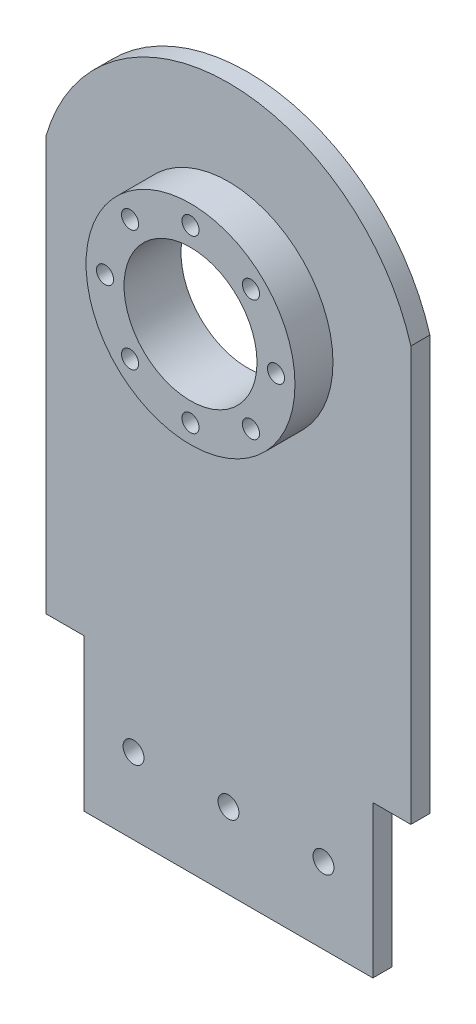
ISO-10303-21;
HEADER;
FILE_DESCRIPTION(('STEP AP214'),'2;1');
FILE_NAME('part.step','',(''),(''),'','','');
FILE_SCHEMA(('AUTOMOTIVE_DESIGN { 1 0 10303 214 1 1 1 1 }'));
ENDSEC;
DATA;
#1=APPLICATION_CONTEXT('core data for automotive mechanical design processes');
#2=APPLICATION_PROTOCOL_DEFINITION('international standard','automotive_design',2000,#1);
#3=PRODUCT_CONTEXT('',#1,'mechanical');
#4=PRODUCT('Part','Part','',(#3));
#5=PRODUCT_RELATED_PRODUCT_CATEGORY('part','',(#4));
#6=PRODUCT_DEFINITION_FORMATION('','',#4);
#7=PRODUCT_DEFINITION_CONTEXT('part definition',#1,'design');
#8=PRODUCT_DEFINITION('design','',#6,#7);
#9=PRODUCT_DEFINITION_SHAPE('','',#8);
#10=(LENGTH_UNIT() NAMED_UNIT(*) SI_UNIT(.MILLI.,.METRE.));
#11=(NAMED_UNIT(*) PLANE_ANGLE_UNIT() SI_UNIT($,.RADIAN.));
#12=(NAMED_UNIT(*) SI_UNIT($,.STERADIAN.) SOLID_ANGLE_UNIT());
#13=UNCERTAINTY_MEASURE_WITH_UNIT(LENGTH_MEASURE(1.E-05),#10,'distance_accuracy_value','');
#14=(GEOMETRIC_REPRESENTATION_CONTEXT(3) GLOBAL_UNCERTAINTY_ASSIGNED_CONTEXT((#13)) GLOBAL_UNIT_ASSIGNED_CONTEXT((#10,
#11,#12)) REPRESENTATION_CONTEXT('',''));
#15=CARTESIAN_POINT('',(0.,0.,0.));
#16=DIRECTION('',(0.,0.,1.));
#17=DIRECTION('',(1.,0.,0.));
#18=AXIS2_PLACEMENT_3D('',#15,#16,#17);
#19=CARTESIAN_POINT('',(0.,95.07,5.));
#20=DIRECTION('',(0.,0.,1.));
#21=DIRECTION('',(1.,0.,0.));
#22=AXIS2_PLACEMENT_3D('',#19,#20,#21);
#23=PLANE('',#22);
#24=CARTESIAN_POINT('',(25.,-20.,5.));
#25=DIRECTION('',(0.,0.,1.));
#26=DIRECTION('',(1.,0.,0.));
#27=AXIS2_PLACEMENT_3D('',#24,#25,#26);
#28=CIRCLE('',#27,2.75);
#29=CARTESIAN_POINT('',(27.75,-20.,4.99999999999999));
#30=VERTEX_POINT('',#29);
#31=EDGE_CURVE('E125',#30,#30,#28,.T.);
#32=ORIENTED_EDGE('',*,*,#31,.F.);
#33=EDGE_LOOP('',(#32));
#34=FACE_BOUND('',#33,.T.);
#35=CARTESIAN_POINT('',(-25.,-20.,5.));
#36=DIRECTION('',(0.,0.,1.));
#37=DIRECTION('',(-1.,0.,0.));
#38=AXIS2_PLACEMENT_3D('',#35,#36,#37);
#39=CIRCLE('',#38,2.75);
#40=CARTESIAN_POINT('',(-22.25,-20.,4.99999999999999));
#41=VERTEX_POINT('',#40);
#42=EDGE_CURVE('E128',#41,#41,#39,.T.);
#43=ORIENTED_EDGE('',*,*,#42,.F.);
#44=EDGE_LOOP('',(#43));
#45=FACE_BOUND('',#44,.T.);
#46=CARTESIAN_POINT('',(0.,-20.,5.));
#47=DIRECTION('',(0.,0.,1.));
#48=DIRECTION('',(1.,0.,0.));
#49=AXIS2_PLACEMENT_3D('',#46,#47,#48);
#50=CIRCLE('',#49,2.75);
#51=CARTESIAN_POINT('',(2.75,-20.,4.99999999999999));
#52=VERTEX_POINT('',#51);
#53=EDGE_CURVE('E267',#52,#52,#50,.T.);
#54=ORIENTED_EDGE('',*,*,#53,.F.);
#55=EDGE_LOOP('',(#54));
#56=FACE_BOUND('',#55,.T.);
#57=DIRECTION('',(0.,1.,0.));
#58=VECTOR('',#57,1.);
#59=CARTESIAN_POINT('',(48.,109.07,5.));
#60=LINE('',#59,#58);
#61=CARTESIAN_POINT('',(48.,0.,5.));
#62=VERTEX_POINT('',#61);
#63=CARTESIAN_POINT('',(48.,109.07,5.));
#64=VERTEX_POINT('',#63);
#65=EDGE_CURVE('E146',#62,#64,#60,.T.);
#66=ORIENTED_EDGE('',*,*,#65,.T.);
#67=CARTESIAN_POINT('',(0.,95.07,5.));
#68=DIRECTION('',(0.,0.,1.));
#69=DIRECTION('',(1.,0.,0.));
#70=AXIS2_PLACEMENT_3D('',#67,#68,#69);
#71=CIRCLE('',#70,50.);
#72=CARTESIAN_POINT('',(-48.,109.07,5.));
#73=VERTEX_POINT('',#72);
#74=EDGE_CURVE('E148',#64,#73,#71,.T.);
#75=ORIENTED_EDGE('',*,*,#74,.T.);
#76=DIRECTION('',(0.,-1.,0.));
#77=VECTOR('',#76,1.);
#78=CARTESIAN_POINT('',(-48.,109.07,5.));
#79=LINE('',#78,#77);
#80=CARTESIAN_POINT('',(-48.,0.,5.));
#81=VERTEX_POINT('',#80);
#82=EDGE_CURVE('E151',#73,#81,#79,.T.);
#83=ORIENTED_EDGE('',*,*,#82,.T.);
#84=DIRECTION('',(1.,0.,0.));
#85=VECTOR('',#84,1.);
#86=CARTESIAN_POINT('',(-48.,0.,5.));
#87=LINE('',#86,#85);
#88=CARTESIAN_POINT('',(-38.,0.,5.));
#89=VERTEX_POINT('',#88);
#90=EDGE_CURVE('E124',#81,#89,#87,.T.);
#91=ORIENTED_EDGE('',*,*,#90,.T.);
#92=DIRECTION('',(0.,-1.,0.));
#93=VECTOR('',#92,1.);
#94=CARTESIAN_POINT('',(-38.,0.,5.));
#95=LINE('',#94,#93);
#96=CARTESIAN_POINT('',(-38.,-40.,5.));
#97=VERTEX_POINT('',#96);
#98=EDGE_CURVE('E106',#89,#97,#95,.T.);
#99=ORIENTED_EDGE('',*,*,#98,.T.);
#100=DIRECTION('',(1.,0.,0.));
#101=VECTOR('',#100,1.);
#102=CARTESIAN_POINT('',(-38.,-40.,5.));
#103=LINE('',#102,#101);
#104=CARTESIAN_POINT('',(38.,-40.,5.));
#105=VERTEX_POINT('',#104);
#106=EDGE_CURVE('E115',#97,#105,#103,.T.);
#107=ORIENTED_EDGE('',*,*,#106,.T.);
#108=DIRECTION('',(0.,1.,0.));
#109=VECTOR('',#108,1.);
#110=CARTESIAN_POINT('',(38.,0.,5.));
#111=LINE('',#110,#109);
#112=CARTESIAN_POINT('',(38.,0.,5.));
#113=VERTEX_POINT('',#112);
#114=EDGE_CURVE('E112',#105,#113,#111,.T.);
#115=ORIENTED_EDGE('',*,*,#114,.T.);
#116=EDGE_CURVE('E153',#113,#62,#87,.T.);
#117=ORIENTED_EDGE('',*,*,#116,.T.);
#118=EDGE_LOOP('',(#66,#75,#83,#91,#99,#107,#115,#117));
#119=FACE_BOUND('',#118,.T.);
#120=CARTESIAN_POINT('',(0.,95.07,5.));
#121=DIRECTION('',(0.,0.,1.));
#122=DIRECTION('',(1.,0.,0.));
#123=AXIS2_PLACEMENT_3D('',#120,#121,#122);
#124=CIRCLE('',#123,27.5);
#125=CARTESIAN_POINT('',(27.5,95.07,5.));
#126=VERTEX_POINT('',#125);
#127=EDGE_CURVE('E263',#126,#126,#124,.T.);
#128=ORIENTED_EDGE('',*,*,#127,.F.);
#129=EDGE_LOOP('',(#128));
#130=FACE_BOUND('',#129,.T.);
#131=ADVANCED_FACE('F35',(#34,#45,#56,#119,#130),#23,.T.);
#132=CARTESIAN_POINT('',(-48.,0.,5.));
#133=DIRECTION('',(0.,1.,0.));
#134=DIRECTION('',(0.,0.,1.));
#135=AXIS2_PLACEMENT_3D('',#132,#133,#134);
#136=PLANE('',#135);
#137=DIRECTION('',(0.,0.,1.));
#138=VECTOR('',#137,1.);
#139=CARTESIAN_POINT('',(38.,0.,-85.8836422143356));
#140=LINE('',#139,#138);
#141=CARTESIAN_POINT('',(38.,0.,0.));
#142=VERTEX_POINT('',#141);
#143=EDGE_CURVE('E58',#142,#113,#140,.T.);
#144=ORIENTED_EDGE('',*,*,#143,.F.);
#145=DIRECTION('',(1.,0.,0.));
#146=VECTOR('',#145,1.);
#147=CARTESIAN_POINT('',(-48.,0.,0.));
#148=LINE('',#147,#146);
#149=CARTESIAN_POINT('',(48.,0.,0.));
#150=VERTEX_POINT('',#149);
#151=EDGE_CURVE('E162',#142,#150,#148,.T.);
#152=ORIENTED_EDGE('',*,*,#151,.T.);
#153=DIRECTION('',(0.,0.,-1.));
#154=VECTOR('',#153,1.);
#155=CARTESIAN_POINT('',(48.,0.,5.));
#156=LINE('',#155,#154);
#157=EDGE_CURVE('E155',#62,#150,#156,.T.);
#158=ORIENTED_EDGE('',*,*,#157,.F.);
#159=ORIENTED_EDGE('',*,*,#116,.F.);
#160=EDGE_LOOP('',(#144,#152,#158,#159));
#161=FACE_BOUND('',#160,.T.);
#162=ADVANCED_FACE('F185',(#161),#136,.F.);
#163=CARTESIAN_POINT('',(0.,95.07,0.));
#164=DIRECTION('',(0.,0.,1.));
#165=DIRECTION('',(1.,0.,0.));
#166=AXIS2_PLACEMENT_3D('',#163,#164,#165);
#167=PLANE('',#166);
#168=CARTESIAN_POINT('',(0.,117.57,0.));
#169=DIRECTION('',(0.,0.,1.));
#170=DIRECTION('',(1.,0.,0.));
#171=AXIS2_PLACEMENT_3D('',#168,#169,#170);
#172=CIRCLE('',#171,2.25);
#173=CARTESIAN_POINT('',(2.25,117.57,0.));
#174=VERTEX_POINT('',#173);
#175=EDGE_CURVE('E215',#174,#174,#172,.T.);
#176=ORIENTED_EDGE('',*,*,#175,.T.);
#177=EDGE_LOOP('',(#176));
#178=FACE_BOUND('',#177,.T.);
#179=CARTESIAN_POINT('',(15.9099025766977,110.979902576698,0.));
#180=DIRECTION('',(0.,0.,1.));
#181=DIRECTION('',(1.,0.,0.));
#182=AXIS2_PLACEMENT_3D('',#179,#180,#181);
#183=CIRCLE('',#182,2.24999999999999);
#184=CARTESIAN_POINT('',(18.1599025766976,110.979902576698,0.));
#185=VERTEX_POINT('',#184);
#186=EDGE_CURVE('E219',#185,#185,#183,.T.);
#187=ORIENTED_EDGE('',*,*,#186,.T.);
#188=EDGE_LOOP('',(#187));
#189=FACE_BOUND('',#188,.T.);
#190=CARTESIAN_POINT('',(22.500000000001,95.0700000000009,0.));
#191=DIRECTION('',(0.,0.,1.));
#192=DIRECTION('',(1.,0.,0.));
#193=AXIS2_PLACEMENT_3D('',#190,#191,#192);
#194=CIRCLE('',#193,2.24999999999999);
#195=CARTESIAN_POINT('',(24.750000000001,95.0700000000009,0.));
#196=VERTEX_POINT('',#195);
#197=EDGE_CURVE('E223',#196,#196,#194,.T.);
#198=ORIENTED_EDGE('',*,*,#197,.T.);
#199=EDGE_LOOP('',(#198));
#200=FACE_BOUND('',#199,.T.);
#201=CARTESIAN_POINT('',(15.9099025766973,79.1600974233027,0.));
#202=DIRECTION('',(0.,0.,1.));
#203=DIRECTION('',(1.,0.,0.));
#204=AXIS2_PLACEMENT_3D('',#201,#202,#203);
#205=CIRCLE('',#204,2.24999999999875);
#206=CARTESIAN_POINT('',(18.1599025766961,79.1600974233027,0.));
#207=VERTEX_POINT('',#206);
#208=EDGE_CURVE('E227',#207,#207,#205,.T.);
#209=ORIENTED_EDGE('',*,*,#208,.T.);
#210=EDGE_LOOP('',(#209));
#211=FACE_BOUND('',#210,.T.);
#212=CARTESIAN_POINT('',(0.,72.57,0.));
#213=DIRECTION('',(0.,0.,1.));
#214=DIRECTION('',(1.,0.,0.));
#215=AXIS2_PLACEMENT_3D('',#212,#213,#214);
#216=CIRCLE('',#215,2.24999999999833);
#217=CARTESIAN_POINT('',(2.24999999999833,72.57,0.));
#218=VERTEX_POINT('',#217);
#219=EDGE_CURVE('E231',#218,#218,#216,.T.);
#220=ORIENTED_EDGE('',*,*,#219,.T.);
#221=EDGE_LOOP('',(#220));
#222=FACE_BOUND('',#221,.T.);
#223=CARTESIAN_POINT('',(-15.9099025766973,79.1600974233027,0.));
#224=DIRECTION('',(0.,0.,1.));
#225=DIRECTION('',(1.,0.,0.));
#226=AXIS2_PLACEMENT_3D('',#223,#224,#225);
#227=CIRCLE('',#226,2.24999999999842);
#228=CARTESIAN_POINT('',(-13.6599025766989,79.1600974233027,0.));
#229=VERTEX_POINT('',#228);
#230=EDGE_CURVE('E235',#229,#229,#227,.T.);
#231=ORIENTED_EDGE('',*,*,#230,.T.);
#232=EDGE_LOOP('',(#231));
#233=FACE_BOUND('',#232,.T.);
#234=CARTESIAN_POINT('',(-22.499999999999,95.0699999999993,0.));
#235=DIRECTION('',(0.,0.,1.));
#236=DIRECTION('',(1.,0.,0.));
#237=AXIS2_PLACEMENT_3D('',#234,#235,#236);
#238=CIRCLE('',#237,2.25);
#239=CARTESIAN_POINT('',(-20.249999999999,95.0699999999993,0.));
#240=VERTEX_POINT('',#239);
#241=EDGE_CURVE('E239',#240,#240,#238,.T.);
#242=ORIENTED_EDGE('',*,*,#241,.T.);
#243=EDGE_LOOP('',(#242));
#244=FACE_BOUND('',#243,.T.);
#245=CARTESIAN_POINT('',(-15.9099025766968,110.979902576697,0.));
#246=DIRECTION('',(0.,0.,1.));
#247=DIRECTION('',(1.,0.,0.));
#248=AXIS2_PLACEMENT_3D('',#245,#246,#247);
#249=CIRCLE('',#248,2.24999999999999);
#250=CARTESIAN_POINT('',(-13.6599025766969,110.979902576697,0.));
#251=VERTEX_POINT('',#250);
#252=EDGE_CURVE('E242',#251,#251,#249,.T.);
#253=ORIENTED_EDGE('',*,*,#252,.T.);
#254=EDGE_LOOP('',(#253));
#255=FACE_BOUND('',#254,.T.);
#256=DIRECTION('',(0.,1.,0.));
#257=VECTOR('',#256,1.);
#258=CARTESIAN_POINT('',(48.,109.07,0.));
#259=LINE('',#258,#257);
#260=CARTESIAN_POINT('',(48.,109.07,0.));
#261=VERTEX_POINT('',#260);
#262=EDGE_CURVE('E145',#150,#261,#259,.T.);
#263=ORIENTED_EDGE('',*,*,#262,.F.);
#264=ORIENTED_EDGE('',*,*,#151,.F.);
#265=DIRECTION('',(0.,-1.,0.));
#266=VECTOR('',#265,1.);
#267=CARTESIAN_POINT('',(38.,0.,0.));
#268=LINE('',#267,#266);
#269=CARTESIAN_POINT('',(38.,-40.,0.));
#270=VERTEX_POINT('',#269);
#271=EDGE_CURVE('E134',#142,#270,#268,.T.);
#272=ORIENTED_EDGE('',*,*,#271,.T.);
#273=DIRECTION('',(-1.,0.,0.));
#274=VECTOR('',#273,1.);
#275=CARTESIAN_POINT('',(-38.,-40.,0.));
#276=LINE('',#275,#274);
#277=CARTESIAN_POINT('',(-38.,-40.,0.));
#278=VERTEX_POINT('',#277);
#279=EDGE_CURVE('E272',#270,#278,#276,.T.);
#280=ORIENTED_EDGE('',*,*,#279,.T.);
#281=DIRECTION('',(0.,1.,0.));
#282=VECTOR('',#281,1.);
#283=CARTESIAN_POINT('',(-38.,0.,0.));
#284=LINE('',#283,#282);
#285=CARTESIAN_POINT('',(-38.,0.,0.));
#286=VERTEX_POINT('',#285);
#287=EDGE_CURVE('E108',#278,#286,#284,.T.);
#288=ORIENTED_EDGE('',*,*,#287,.T.);
#289=CARTESIAN_POINT('',(-48.,0.,0.));
#290=VERTEX_POINT('',#289);
#291=EDGE_CURVE('E149',#290,#286,#148,.T.);
#292=ORIENTED_EDGE('',*,*,#291,.F.);
#293=DIRECTION('',(0.,-1.,0.));
#294=VECTOR('',#293,1.);
#295=CARTESIAN_POINT('',(-48.,109.07,0.));
#296=LINE('',#295,#294);
#297=CARTESIAN_POINT('',(-48.,109.07,0.));
#298=VERTEX_POINT('',#297);
#299=EDGE_CURVE('E160',#298,#290,#296,.T.);
#300=ORIENTED_EDGE('',*,*,#299,.F.);
#301=CARTESIAN_POINT('',(0.,95.07,0.));
#302=DIRECTION('',(0.,0.,1.));
#303=DIRECTION('',(1.,0.,0.));
#304=AXIS2_PLACEMENT_3D('',#301,#302,#303);
#305=CIRCLE('',#304,50.);
#306=EDGE_CURVE('E158',#261,#298,#305,.T.);
#307=ORIENTED_EDGE('',*,*,#306,.F.);
#308=EDGE_LOOP('',(#263,#264,#272,#280,#288,#292,#300,#307));
#309=FACE_BOUND('',#308,.T.);
#310=CARTESIAN_POINT('',(0.,95.07,0.));
#311=DIRECTION('',(0.,0.,1.));
#312=DIRECTION('',(1.,0.,0.));
#313=AXIS2_PLACEMENT_3D('',#310,#311,#312);
#314=CIRCLE('',#313,17.5);
#315=CARTESIAN_POINT('',(17.5,95.07,0.));
#316=VERTEX_POINT('',#315);
#317=EDGE_CURVE('E142',#316,#316,#314,.T.);
#318=ORIENTED_EDGE('',*,*,#317,.T.);
#319=EDGE_LOOP('',(#318));
#320=FACE_BOUND('',#319,.T.);
#321=CARTESIAN_POINT('',(-25.,-20.,0.));
#322=DIRECTION('',(0.,0.,1.));
#323=DIRECTION('',(1.,0.,0.));
#324=AXIS2_PLACEMENT_3D('',#321,#322,#323);
#325=CIRCLE('',#324,2.75);
#326=CARTESIAN_POINT('',(-22.25,-20.,0.));
#327=VERTEX_POINT('',#326);
#328=EDGE_CURVE('E141',#327,#327,#325,.F.);
#329=ORIENTED_EDGE('',*,*,#328,.F.);
#330=EDGE_LOOP('',(#329));
#331=FACE_BOUND('',#330,.T.);
#332=CARTESIAN_POINT('',(0.,-20.,0.));
#333=DIRECTION('',(0.,0.,1.));
#334=DIRECTION('',(1.,0.,0.));
#335=AXIS2_PLACEMENT_3D('',#332,#333,#334);
#336=CIRCLE('',#335,2.75);
#337=CARTESIAN_POINT('',(2.75,-20.,0.));
#338=VERTEX_POINT('',#337);
#339=EDGE_CURVE('E137',#338,#338,#336,.F.);
#340=ORIENTED_EDGE('',*,*,#339,.F.);
#341=EDGE_LOOP('',(#340));
#342=FACE_BOUND('',#341,.T.);
#343=CARTESIAN_POINT('',(25.,-20.,0.));
#344=DIRECTION('',(0.,0.,1.));
#345=DIRECTION('',(1.,0.,0.));
#346=AXIS2_PLACEMENT_3D('',#343,#344,#345);
#347=CIRCLE('',#346,2.75);
#348=CARTESIAN_POINT('',(27.75,-20.,0.));
#349=VERTEX_POINT('',#348);
#350=EDGE_CURVE('E140',#349,#349,#347,.F.);
#351=ORIENTED_EDGE('',*,*,#350,.F.);
#352=EDGE_LOOP('',(#351));
#353=FACE_BOUND('',#352,.T.);
#354=ADVANCED_FACE('F179',(#178,#189,#200,#211,#222,#233,#244,#255,#309,#320,#331,#342,#353),
#167,.F.);
#355=CARTESIAN_POINT('',(48.,109.07,5.));
#356=DIRECTION('',(-1.,0.,0.));
#357=DIRECTION('',(0.,-1.,0.));
#358=AXIS2_PLACEMENT_3D('',#355,#356,#357);
#359=PLANE('',#358);
#360=ORIENTED_EDGE('',*,*,#262,.T.);
#361=DIRECTION('',(0.,0.,-1.));
#362=VECTOR('',#361,1.);
#363=CARTESIAN_POINT('',(48.,109.07,5.));
#364=LINE('',#363,#362);
#365=EDGE_CURVE('E11',#64,#261,#364,.T.);
#366=ORIENTED_EDGE('',*,*,#365,.F.);
#367=ORIENTED_EDGE('',*,*,#65,.F.);
#368=ORIENTED_EDGE('',*,*,#157,.T.);
#369=EDGE_LOOP('',(#360,#366,#367,#368));
#370=FACE_BOUND('',#369,.T.);
#371=ADVANCED_FACE('F37',(#370),#359,.F.);
#372=CARTESIAN_POINT('',(0.,95.07,5.));
#373=DIRECTION('',(0.,0.,-1.));
#374=DIRECTION('',(-1.,0.,0.));
#375=AXIS2_PLACEMENT_3D('',#372,#373,#374);
#376=CYLINDRICAL_SURFACE('',#375,50.);
#377=ORIENTED_EDGE('',*,*,#306,.T.);
#378=DIRECTION('',(0.,0.,-1.));
#379=VECTOR('',#378,1.);
#380=CARTESIAN_POINT('',(-48.,109.07,5.));
#381=LINE('',#380,#379);
#382=EDGE_CURVE('E43',#73,#298,#381,.T.);
#383=ORIENTED_EDGE('',*,*,#382,.F.);
#384=ORIENTED_EDGE('',*,*,#74,.F.);
#385=ORIENTED_EDGE('',*,*,#365,.T.);
#386=EDGE_LOOP('',(#377,#383,#384,#385));
#387=FACE_BOUND('',#386,.T.);
#388=ADVANCED_FACE('F192',(#387),#376,.T.);
#389=CARTESIAN_POINT('',(-48.,109.07,5.));
#390=DIRECTION('',(1.,0.,0.));
#391=DIRECTION('',(0.,1.,0.));
#392=AXIS2_PLACEMENT_3D('',#389,#390,#391);
#393=PLANE('',#392);
#394=ORIENTED_EDGE('',*,*,#299,.T.);
#395=DIRECTION('',(0.,0.,-1.));
#396=VECTOR('',#395,1.);
#397=CARTESIAN_POINT('',(-48.,0.,5.));
#398=LINE('',#397,#396);
#399=EDGE_CURVE('E166',#81,#290,#398,.T.);
#400=ORIENTED_EDGE('',*,*,#399,.F.);
#401=ORIENTED_EDGE('',*,*,#82,.F.);
#402=ORIENTED_EDGE('',*,*,#382,.T.);
#403=EDGE_LOOP('',(#394,#400,#401,#402));
#404=FACE_BOUND('',#403,.T.);
#405=ADVANCED_FACE('F173',(#404),#393,.F.);
#406=ORIENTED_EDGE('',*,*,#291,.T.);
#407=DIRECTION('',(0.,0.,1.));
#408=VECTOR('',#407,1.);
#409=CARTESIAN_POINT('',(-38.,0.,-85.8836422143356));
#410=LINE('',#409,#408);
#411=EDGE_CURVE('E50',#286,#89,#410,.T.);
#412=ORIENTED_EDGE('',*,*,#411,.T.);
#413=ORIENTED_EDGE('',*,*,#90,.F.);
#414=ORIENTED_EDGE('',*,*,#399,.T.);
#415=EDGE_LOOP('',(#406,#412,#413,#414));
#416=FACE_BOUND('',#415,.T.);
#417=ADVANCED_FACE('F181',(#416),#136,.F.);
#418=CARTESIAN_POINT('',(0.,95.07,5.));
#419=DIRECTION('',(0.,0.,-1.));
#420=DIRECTION('',(-1.,0.,0.));
#421=AXIS2_PLACEMENT_3D('',#418,#419,#420);
#422=CYLINDRICAL_SURFACE('',#421,17.5);
#423=ORIENTED_EDGE('',*,*,#317,.F.);
#424=EDGE_LOOP('',(#423));
#425=FACE_BOUND('',#424,.T.);
#426=CARTESIAN_POINT('',(0.,95.07,15.));
#427=DIRECTION('',(0.,0.,1.));
#428=DIRECTION('',(1.,0.,0.));
#429=AXIS2_PLACEMENT_3D('',#426,#427,#428);
#430=CIRCLE('',#429,17.5);
#431=CARTESIAN_POINT('',(17.5,95.07,15.));
#432=VERTEX_POINT('',#431);
#433=EDGE_CURVE('E260',#432,#432,#430,.T.);
#434=ORIENTED_EDGE('',*,*,#433,.T.);
#435=EDGE_LOOP('',(#434));
#436=FACE_BOUND('',#435,.T.);
#437=ADVANCED_FACE('F183',(#425,#436),#422,.F.);
#438=CARTESIAN_POINT('',(-38.,-40.,-85.8836422143356));
#439=DIRECTION('',(0.,-1.,0.));
#440=DIRECTION('',(1.,0.,0.));
#441=AXIS2_PLACEMENT_3D('',#438,#439,#440);
#442=PLANE('',#441);
#443=ORIENTED_EDGE('',*,*,#279,.F.);
#444=DIRECTION('',(0.,0.,1.));
#445=VECTOR('',#444,1.);
#446=CARTESIAN_POINT('',(38.,-40.,-85.8836422143356));
#447=LINE('',#446,#445);
#448=EDGE_CURVE('E111',#270,#105,#447,.T.);
#449=ORIENTED_EDGE('',*,*,#448,.T.);
#450=ORIENTED_EDGE('',*,*,#106,.F.);
#451=DIRECTION('',(0.,0.,1.));
#452=VECTOR('',#451,1.);
#453=CARTESIAN_POINT('',(-38.,-40.,-85.8836422143356));
#454=LINE('',#453,#452);
#455=EDGE_CURVE('E102',#278,#97,#454,.T.);
#456=ORIENTED_EDGE('',*,*,#455,.F.);
#457=EDGE_LOOP('',(#443,#449,#450,#456));
#458=FACE_BOUND('',#457,.T.);
#459=ADVANCED_FACE('F116',(#458),#442,.T.);
#460=CARTESIAN_POINT('',(38.,0.,-85.8836422143356));
#461=DIRECTION('',(1.,0.,0.));
#462=DIRECTION('',(0.,1.,0.));
#463=AXIS2_PLACEMENT_3D('',#460,#461,#462);
#464=PLANE('',#463);
#465=ORIENTED_EDGE('',*,*,#271,.F.);
#466=ORIENTED_EDGE('',*,*,#143,.T.);
#467=ORIENTED_EDGE('',*,*,#114,.F.);
#468=ORIENTED_EDGE('',*,*,#448,.F.);
#469=EDGE_LOOP('',(#465,#466,#467,#468));
#470=FACE_BOUND('',#469,.T.);
#471=ADVANCED_FACE('F306',(#470),#464,.T.);
#472=CARTESIAN_POINT('',(-38.,0.,-85.8836422143356));
#473=DIRECTION('',(-1.,0.,0.));
#474=DIRECTION('',(0.,0.,1.));
#475=AXIS2_PLACEMENT_3D('',#472,#473,#474);
#476=PLANE('',#475);
#477=ORIENTED_EDGE('',*,*,#287,.F.);
#478=ORIENTED_EDGE('',*,*,#455,.T.);
#479=ORIENTED_EDGE('',*,*,#98,.F.);
#480=ORIENTED_EDGE('',*,*,#411,.F.);
#481=EDGE_LOOP('',(#477,#478,#479,#480));
#482=FACE_BOUND('',#481,.T.);
#483=ADVANCED_FACE('F104',(#482),#476,.T.);
#484=CARTESIAN_POINT('',(25.,-20.,-85.8836422143356));
#485=DIRECTION('',(0.,0.,1.));
#486=DIRECTION('',(1.,0.,0.));
#487=AXIS2_PLACEMENT_3D('',#484,#485,#486);
#488=CYLINDRICAL_SURFACE('',#487,2.75);
#489=CARTESIAN_POINT('',(27.75,-20.,0.));
#490=CARTESIAN_POINT('',(27.75,-20.,0.0520833333333183));
#491=CARTESIAN_POINT('',(27.75,-20.,0.104166666666651));
#492=CARTESIAN_POINT('',(27.75,-20.,0.208333333333315));
#493=CARTESIAN_POINT('',(27.75,-20.,0.260416666666647));
#494=CARTESIAN_POINT('',(27.75,-20.,0.364583333333316));
#495=CARTESIAN_POINT('',(27.75,-20.,0.416666666666653));
#496=CARTESIAN_POINT('',(27.75,-20.,0.520833333333322));
#497=CARTESIAN_POINT('',(27.75,-20.,0.572916666666654));
#498=CARTESIAN_POINT('',(27.75,-20.,0.677083333333319));
#499=CARTESIAN_POINT('',(27.75,-20.,0.729166666666651));
#500=CARTESIAN_POINT('',(27.75,-20.,0.83333333333332));
#501=CARTESIAN_POINT('',(27.75,-20.,0.885416666666657));
#502=CARTESIAN_POINT('',(27.75,-20.,0.989583333333326));
#503=CARTESIAN_POINT('',(27.75,-20.,1.04166666666666));
#504=CARTESIAN_POINT('',(27.75,-20.,1.14583333333332));
#505=CARTESIAN_POINT('',(27.75,-20.,1.19791666666665));
#506=CARTESIAN_POINT('',(27.75,-20.,1.30208333333332));
#507=CARTESIAN_POINT('',(27.75,-20.,1.35416666666665));
#508=CARTESIAN_POINT('',(27.75,-20.,1.45833333333332));
#509=CARTESIAN_POINT('',(27.75,-20.,1.51041666666665));
#510=CARTESIAN_POINT('',(27.75,-20.,1.61458333333332));
#511=CARTESIAN_POINT('',(27.75,-20.,1.66666666666665));
#512=CARTESIAN_POINT('',(27.75,-20.,1.77083333333332));
#513=CARTESIAN_POINT('',(27.75,-20.,1.82291666666666));
#514=CARTESIAN_POINT('',(27.75,-20.,1.92708333333332));
#515=CARTESIAN_POINT('',(27.75,-20.,1.97916666666665));
#516=CARTESIAN_POINT('',(27.75,-20.,2.08333333333332));
#517=CARTESIAN_POINT('',(27.75,-20.,2.13541666666666));
#518=CARTESIAN_POINT('',(27.75,-20.,2.23958333333333));
#519=CARTESIAN_POINT('',(27.75,-20.,2.29166666666666));
#520=CARTESIAN_POINT('',(27.75,-20.,2.39583333333332));
#521=CARTESIAN_POINT('',(27.75,-20.,2.44791666666666));
#522=CARTESIAN_POINT('',(27.75,-20.,2.55208333333332));
#523=CARTESIAN_POINT('',(27.75,-20.,2.60416666666665));
#524=CARTESIAN_POINT('',(27.75,-20.,2.70833333333332));
#525=CARTESIAN_POINT('',(27.75,-20.,2.76041666666665));
#526=CARTESIAN_POINT('',(27.75,-20.,2.86458333333332));
#527=CARTESIAN_POINT('',(27.75,-20.,2.91666666666666));
#528=CARTESIAN_POINT('',(27.75,-20.,3.02083333333332));
#529=CARTESIAN_POINT('',(27.75,-20.,3.07291666666666));
#530=CARTESIAN_POINT('',(27.75,-20.,3.17708333333332));
#531=CARTESIAN_POINT('',(27.75,-20.,3.22916666666665));
#532=CARTESIAN_POINT('',(27.75,-20.,3.33333333333332));
#533=CARTESIAN_POINT('',(27.75,-20.,3.38541666666666));
#534=CARTESIAN_POINT('',(27.75,-20.,3.48958333333333));
#535=CARTESIAN_POINT('',(27.75,-20.,3.54166666666666));
#536=CARTESIAN_POINT('',(27.75,-20.,3.64583333333333));
#537=CARTESIAN_POINT('',(27.75,-20.,3.69791666666666));
#538=CARTESIAN_POINT('',(27.75,-20.,3.80208333333332));
#539=CARTESIAN_POINT('',(27.75,-20.,3.85416666666665));
#540=CARTESIAN_POINT('',(27.75,-20.,3.95833333333332));
#541=CARTESIAN_POINT('',(27.75,-20.,4.01041666666665));
#542=CARTESIAN_POINT('',(27.75,-20.,4.11458333333332));
#543=CARTESIAN_POINT('',(27.75,-20.,4.16666666666666));
#544=CARTESIAN_POINT('',(27.75,-20.,4.27083333333333));
#545=CARTESIAN_POINT('',(27.75,-20.,4.32291666666666));
#546=CARTESIAN_POINT('',(27.75,-20.,4.42708333333332));
#547=CARTESIAN_POINT('',(27.75,-20.,4.47916666666665));
#548=CARTESIAN_POINT('',(27.75,-20.,4.58333333333332));
#549=CARTESIAN_POINT('',(27.75,-20.,4.63541666666666));
#550=CARTESIAN_POINT('',(27.75,-20.,4.73958333333333));
#551=CARTESIAN_POINT('',(27.75,-20.,4.79166666666666));
#552=CARTESIAN_POINT('',(27.75,-20.,4.89583333333333));
#553=CARTESIAN_POINT('',(27.75,-20.,4.94791666666666));
#554=CARTESIAN_POINT('',(27.75,-20.,4.99999999999999));
#555=B_SPLINE_CURVE_WITH_KNOTS('',3,(#489,#490,#491,#492,#493,#494,#495,#496,#497,#498,#499,
#500,#501,#502,#503,#504,#505,#506,#507,#508,#509,#510,#511,#512,#513,#514,#515,#516,#517,#518,
#519,#520,#521,#522,#523,#524,#525,#526,#527,#528,#529,#530,#531,#532,#533,#534,#535,#536,#537,
#538,#539,#540,#541,#542,#543,#544,#545,#546,#547,#548,#549,#550,#551,#552,#553,#554),
.UNSPECIFIED.,.F.,.F.,(4,2,2,2,2,2,2,2,2,2,2,2,2,2,2,2,2,2,2,2,2,2,2,2,2,2,2,2,2,2,2,2,4),(0.,
0.156249999999997,0.312499999999993,0.468750000000004,0.625000000000001,0.781249999999997,
0.937500000000008,1.09375,1.25,1.40625,1.56249999999999,1.71875,1.875,2.03125,2.18750000000001,
2.34375000000001,2.5,2.65625,2.8125,2.96875000000001,3.125,3.28125,3.43750000000001,
3.59375000000001,3.75,3.90625,4.0625,4.21875000000001,4.375,4.53125,4.68750000000001,
4.84375000000001,5.),.UNSPECIFIED.);
#556=EDGE_CURVE('BSEAM298',#349,#30,#555,.T.);
#557=ORIENTED_EDGE('',*,*,#350,.T.);
#558=ORIENTED_EDGE('',*,*,#31,.T.);
#559=ORIENTED_EDGE('',*,*,#556,.T.);
#560=ORIENTED_EDGE('',*,*,#556,.F.);
#561=EDGE_LOOP('',(#557,#559,#558,#560));
#562=FACE_BOUND('',#561,.T.);
#563=ADVANCED_FACE('F298',(#562),#488,.F.);
#564=CARTESIAN_POINT('',(-25.,-20.,-85.8836422143356));
#565=DIRECTION('',(0.,0.,1.));
#566=DIRECTION('',(1.,0.,0.));
#567=AXIS2_PLACEMENT_3D('',#564,#565,#566);
#568=CYLINDRICAL_SURFACE('',#567,2.75);
#569=CARTESIAN_POINT('',(-22.25,-20.,0.));
#570=CARTESIAN_POINT('',(-22.25,-20.,0.0520833333333183));
#571=CARTESIAN_POINT('',(-22.25,-20.,0.104166666666651));
#572=CARTESIAN_POINT('',(-22.25,-20.,0.208333333333315));
#573=CARTESIAN_POINT('',(-22.25,-20.,0.260416666666647));
#574=CARTESIAN_POINT('',(-22.25,-20.,0.364583333333316));
#575=CARTESIAN_POINT('',(-22.25,-20.,0.416666666666653));
#576=CARTESIAN_POINT('',(-22.25,-20.,0.520833333333322));
#577=CARTESIAN_POINT('',(-22.25,-20.,0.572916666666654));
#578=CARTESIAN_POINT('',(-22.25,-20.,0.677083333333319));
#579=CARTESIAN_POINT('',(-22.25,-20.,0.729166666666651));
#580=CARTESIAN_POINT('',(-22.25,-20.,0.83333333333332));
#581=CARTESIAN_POINT('',(-22.25,-20.,0.885416666666657));
#582=CARTESIAN_POINT('',(-22.25,-20.,0.989583333333326));
#583=CARTESIAN_POINT('',(-22.25,-20.,1.04166666666666));
#584=CARTESIAN_POINT('',(-22.25,-20.,1.14583333333332));
#585=CARTESIAN_POINT('',(-22.25,-20.,1.19791666666665));
#586=CARTESIAN_POINT('',(-22.25,-20.,1.30208333333332));
#587=CARTESIAN_POINT('',(-22.25,-20.,1.35416666666665));
#588=CARTESIAN_POINT('',(-22.25,-20.,1.45833333333332));
#589=CARTESIAN_POINT('',(-22.25,-20.,1.51041666666665));
#590=CARTESIAN_POINT('',(-22.25,-20.,1.61458333333332));
#591=CARTESIAN_POINT('',(-22.25,-20.,1.66666666666665));
#592=CARTESIAN_POINT('',(-22.25,-20.,1.77083333333332));
#593=CARTESIAN_POINT('',(-22.25,-20.,1.82291666666666));
#594=CARTESIAN_POINT('',(-22.25,-20.,1.92708333333332));
#595=CARTESIAN_POINT('',(-22.25,-20.,1.97916666666665));
#596=CARTESIAN_POINT('',(-22.25,-20.,2.08333333333332));
#597=CARTESIAN_POINT('',(-22.25,-20.,2.13541666666666));
#598=CARTESIAN_POINT('',(-22.25,-20.,2.23958333333333));
#599=CARTESIAN_POINT('',(-22.25,-20.,2.29166666666666));
#600=CARTESIAN_POINT('',(-22.25,-20.,2.39583333333332));
#601=CARTESIAN_POINT('',(-22.25,-20.,2.44791666666666));
#602=CARTESIAN_POINT('',(-22.25,-20.,2.55208333333332));
#603=CARTESIAN_POINT('',(-22.25,-20.,2.60416666666665));
#604=CARTESIAN_POINT('',(-22.25,-20.,2.70833333333332));
#605=CARTESIAN_POINT('',(-22.25,-20.,2.76041666666665));
#606=CARTESIAN_POINT('',(-22.25,-20.,2.86458333333332));
#607=CARTESIAN_POINT('',(-22.25,-20.,2.91666666666666));
#608=CARTESIAN_POINT('',(-22.25,-20.,3.02083333333332));
#609=CARTESIAN_POINT('',(-22.25,-20.,3.07291666666666));
#610=CARTESIAN_POINT('',(-22.25,-20.,3.17708333333332));
#611=CARTESIAN_POINT('',(-22.25,-20.,3.22916666666665));
#612=CARTESIAN_POINT('',(-22.25,-20.,3.33333333333332));
#613=CARTESIAN_POINT('',(-22.25,-20.,3.38541666666666));
#614=CARTESIAN_POINT('',(-22.25,-20.,3.48958333333333));
#615=CARTESIAN_POINT('',(-22.25,-20.,3.54166666666666));
#616=CARTESIAN_POINT('',(-22.25,-20.,3.64583333333333));
#617=CARTESIAN_POINT('',(-22.25,-20.,3.69791666666666));
#618=CARTESIAN_POINT('',(-22.25,-20.,3.80208333333332));
#619=CARTESIAN_POINT('',(-22.25,-20.,3.85416666666665));
#620=CARTESIAN_POINT('',(-22.25,-20.,3.95833333333332));
#621=CARTESIAN_POINT('',(-22.25,-20.,4.01041666666665));
#622=CARTESIAN_POINT('',(-22.25,-20.,4.11458333333332));
#623=CARTESIAN_POINT('',(-22.25,-20.,4.16666666666666));
#624=CARTESIAN_POINT('',(-22.25,-20.,4.27083333333333));
#625=CARTESIAN_POINT('',(-22.25,-20.,4.32291666666666));
#626=CARTESIAN_POINT('',(-22.25,-20.,4.42708333333332));
#627=CARTESIAN_POINT('',(-22.25,-20.,4.47916666666665));
#628=CARTESIAN_POINT('',(-22.25,-20.,4.58333333333332));
#629=CARTESIAN_POINT('',(-22.25,-20.,4.63541666666666));
#630=CARTESIAN_POINT('',(-22.25,-20.,4.73958333333333));
#631=CARTESIAN_POINT('',(-22.25,-20.,4.79166666666666));
#632=CARTESIAN_POINT('',(-22.25,-20.,4.89583333333333));
#633=CARTESIAN_POINT('',(-22.25,-20.,4.94791666666666));
#634=CARTESIAN_POINT('',(-22.25,-20.,4.99999999999999));
#635=B_SPLINE_CURVE_WITH_KNOTS('',3,(#569,#570,#571,#572,#573,#574,#575,#576,#577,#578,#579,
#580,#581,#582,#583,#584,#585,#586,#587,#588,#589,#590,#591,#592,#593,#594,#595,#596,#597,#598,
#599,#600,#601,#602,#603,#604,#605,#606,#607,#608,#609,#610,#611,#612,#613,#614,#615,#616,#617,
#618,#619,#620,#621,#622,#623,#624,#625,#626,#627,#628,#629,#630,#631,#632,#633,#634),
.UNSPECIFIED.,.F.,.F.,(4,2,2,2,2,2,2,2,2,2,2,2,2,2,2,2,2,2,2,2,2,2,2,2,2,2,2,2,2,2,2,2,4),(0.,
0.156249999999997,0.312499999999993,0.468750000000004,0.625000000000001,0.781249999999997,
0.937500000000008,1.09375,1.25,1.40625,1.56249999999999,1.71875,1.875,2.03125,2.18750000000001,
2.34375000000001,2.5,2.65625,2.8125,2.96875000000001,3.125,3.28125,3.43750000000001,
3.59375000000001,3.75,3.90625,4.0625,4.21875000000001,4.375,4.53125,4.68750000000001,
4.84375000000001,5.),.UNSPECIFIED.);
#636=EDGE_CURVE('BSEAM282',#327,#41,#635,.T.);
#637=ORIENTED_EDGE('',*,*,#328,.T.);
#638=ORIENTED_EDGE('',*,*,#42,.T.);
#639=ORIENTED_EDGE('',*,*,#636,.T.);
#640=ORIENTED_EDGE('',*,*,#636,.F.);
#641=EDGE_LOOP('',(#637,#639,#638,#640));
#642=FACE_BOUND('',#641,.T.);
#643=ADVANCED_FACE('F282',(#642),#568,.F.);
#644=CARTESIAN_POINT('',(0.,-20.,-85.8836422143356));
#645=DIRECTION('',(0.,0.,1.));
#646=DIRECTION('',(1.,0.,0.));
#647=AXIS2_PLACEMENT_3D('',#644,#645,#646);
#648=CYLINDRICAL_SURFACE('',#647,2.75);
#649=CARTESIAN_POINT('',(2.75,-20.,0.));
#650=CARTESIAN_POINT('',(2.75,-20.,0.0520833333333183));
#651=CARTESIAN_POINT('',(2.75,-20.,0.104166666666651));
#652=CARTESIAN_POINT('',(2.75,-20.,0.208333333333315));
#653=CARTESIAN_POINT('',(2.75,-20.,0.260416666666647));
#654=CARTESIAN_POINT('',(2.75,-20.,0.364583333333316));
#655=CARTESIAN_POINT('',(2.75,-20.,0.416666666666653));
#656=CARTESIAN_POINT('',(2.75,-20.,0.520833333333322));
#657=CARTESIAN_POINT('',(2.75,-20.,0.572916666666654));
#658=CARTESIAN_POINT('',(2.75,-20.,0.677083333333319));
#659=CARTESIAN_POINT('',(2.75,-20.,0.729166666666651));
#660=CARTESIAN_POINT('',(2.75,-20.,0.83333333333332));
#661=CARTESIAN_POINT('',(2.75,-20.,0.885416666666657));
#662=CARTESIAN_POINT('',(2.75,-20.,0.989583333333326));
#663=CARTESIAN_POINT('',(2.75,-20.,1.04166666666666));
#664=CARTESIAN_POINT('',(2.75,-20.,1.14583333333332));
#665=CARTESIAN_POINT('',(2.75,-20.,1.19791666666665));
#666=CARTESIAN_POINT('',(2.75,-20.,1.30208333333332));
#667=CARTESIAN_POINT('',(2.75,-20.,1.35416666666665));
#668=CARTESIAN_POINT('',(2.75,-20.,1.45833333333332));
#669=CARTESIAN_POINT('',(2.75,-20.,1.51041666666665));
#670=CARTESIAN_POINT('',(2.75,-20.,1.61458333333332));
#671=CARTESIAN_POINT('',(2.75,-20.,1.66666666666665));
#672=CARTESIAN_POINT('',(2.75,-20.,1.77083333333332));
#673=CARTESIAN_POINT('',(2.75,-20.,1.82291666666666));
#674=CARTESIAN_POINT('',(2.75,-20.,1.92708333333332));
#675=CARTESIAN_POINT('',(2.75,-20.,1.97916666666665));
#676=CARTESIAN_POINT('',(2.75,-20.,2.08333333333332));
#677=CARTESIAN_POINT('',(2.75,-20.,2.13541666666666));
#678=CARTESIAN_POINT('',(2.75,-20.,2.23958333333333));
#679=CARTESIAN_POINT('',(2.75,-20.,2.29166666666666));
#680=CARTESIAN_POINT('',(2.75,-20.,2.39583333333332));
#681=CARTESIAN_POINT('',(2.75,-20.,2.44791666666666));
#682=CARTESIAN_POINT('',(2.75,-20.,2.55208333333332));
#683=CARTESIAN_POINT('',(2.75,-20.,2.60416666666665));
#684=CARTESIAN_POINT('',(2.75,-20.,2.70833333333332));
#685=CARTESIAN_POINT('',(2.75,-20.,2.76041666666665));
#686=CARTESIAN_POINT('',(2.75,-20.,2.86458333333332));
#687=CARTESIAN_POINT('',(2.75,-20.,2.91666666666666));
#688=CARTESIAN_POINT('',(2.75,-20.,3.02083333333332));
#689=CARTESIAN_POINT('',(2.75,-20.,3.07291666666666));
#690=CARTESIAN_POINT('',(2.75,-20.,3.17708333333332));
#691=CARTESIAN_POINT('',(2.75,-20.,3.22916666666665));
#692=CARTESIAN_POINT('',(2.75,-20.,3.33333333333332));
#693=CARTESIAN_POINT('',(2.75,-20.,3.38541666666666));
#694=CARTESIAN_POINT('',(2.75,-20.,3.48958333333333));
#695=CARTESIAN_POINT('',(2.75,-20.,3.54166666666666));
#696=CARTESIAN_POINT('',(2.75,-20.,3.64583333333333));
#697=CARTESIAN_POINT('',(2.75,-20.,3.69791666666666));
#698=CARTESIAN_POINT('',(2.75,-20.,3.80208333333332));
#699=CARTESIAN_POINT('',(2.75,-20.,3.85416666666665));
#700=CARTESIAN_POINT('',(2.75,-20.,3.95833333333332));
#701=CARTESIAN_POINT('',(2.75,-20.,4.01041666666665));
#702=CARTESIAN_POINT('',(2.75,-20.,4.11458333333332));
#703=CARTESIAN_POINT('',(2.75,-20.,4.16666666666666));
#704=CARTESIAN_POINT('',(2.75,-20.,4.27083333333333));
#705=CARTESIAN_POINT('',(2.75,-20.,4.32291666666666));
#706=CARTESIAN_POINT('',(2.75,-20.,4.42708333333332));
#707=CARTESIAN_POINT('',(2.75,-20.,4.47916666666665));
#708=CARTESIAN_POINT('',(2.75,-20.,4.58333333333332));
#709=CARTESIAN_POINT('',(2.75,-20.,4.63541666666666));
#710=CARTESIAN_POINT('',(2.75,-20.,4.73958333333333));
#711=CARTESIAN_POINT('',(2.75,-20.,4.79166666666666));
#712=CARTESIAN_POINT('',(2.75,-20.,4.89583333333333));
#713=CARTESIAN_POINT('',(2.75,-20.,4.94791666666666));
#714=CARTESIAN_POINT('',(2.75,-20.,4.99999999999999));
#715=B_SPLINE_CURVE_WITH_KNOTS('',3,(#649,#650,#651,#652,#653,#654,#655,#656,#657,#658,#659,
#660,#661,#662,#663,#664,#665,#666,#667,#668,#669,#670,#671,#672,#673,#674,#675,#676,#677,#678,
#679,#680,#681,#682,#683,#684,#685,#686,#687,#688,#689,#690,#691,#692,#693,#694,#695,#696,#697,
#698,#699,#700,#701,#702,#703,#704,#705,#706,#707,#708,#709,#710,#711,#712,#713,#714),
.UNSPECIFIED.,.F.,.F.,(4,2,2,2,2,2,2,2,2,2,2,2,2,2,2,2,2,2,2,2,2,2,2,2,2,2,2,2,2,2,2,2,4),(0.,
0.156249999999997,0.312499999999993,0.468750000000004,0.625000000000001,0.781249999999997,
0.937500000000008,1.09375,1.25,1.40625,1.56249999999999,1.71875,1.875,2.03125,2.18750000000001,
2.34375000000001,2.5,2.65625,2.8125,2.96875000000001,3.125,3.28125,3.43750000000001,
3.59375000000001,3.75,3.90625,4.0625,4.21875000000001,4.375,4.53125,4.68750000000001,
4.84375000000001,5.),.UNSPECIFIED.);
#716=EDGE_CURVE('BSEAM286',#338,#52,#715,.T.);
#717=ORIENTED_EDGE('',*,*,#339,.T.);
#718=ORIENTED_EDGE('',*,*,#53,.T.);
#719=ORIENTED_EDGE('',*,*,#716,.T.);
#720=ORIENTED_EDGE('',*,*,#716,.F.);
#721=EDGE_LOOP('',(#717,#719,#718,#720));
#722=FACE_BOUND('',#721,.T.);
#723=ADVANCED_FACE('F286',(#722),#648,.F.);
#724=CARTESIAN_POINT('',(0.,95.07,15.));
#725=DIRECTION('',(0.,0.,1.));
#726=DIRECTION('',(1.,0.,0.));
#727=AXIS2_PLACEMENT_3D('',#724,#725,#726);
#728=PLANE('',#727);
#729=CARTESIAN_POINT('',(0.,117.57,15.));
#730=DIRECTION('',(0.,0.,1.));
#731=DIRECTION('',(1.,0.,0.));
#732=AXIS2_PLACEMENT_3D('',#729,#730,#731);
#733=CIRCLE('',#732,2.25);
#734=CARTESIAN_POINT('',(2.25,117.57,15.));
#735=VERTEX_POINT('',#734);
#736=EDGE_CURVE('E244',#735,#735,#733,.T.);
#737=ORIENTED_EDGE('',*,*,#736,.F.);
#738=EDGE_LOOP('',(#737));
#739=FACE_BOUND('',#738,.T.);
#740=CARTESIAN_POINT('',(15.9099025766977,110.979902576698,15.));
#741=DIRECTION('',(0.,0.,1.));
#742=DIRECTION('',(1.,0.,0.));
#743=AXIS2_PLACEMENT_3D('',#740,#741,#742);
#744=CIRCLE('',#743,2.24999999999999);
#745=CARTESIAN_POINT('',(18.1599025766976,110.979902576698,15.));
#746=VERTEX_POINT('',#745);
#747=EDGE_CURVE('E248',#746,#746,#744,.T.);
#748=ORIENTED_EDGE('',*,*,#747,.F.);
#749=EDGE_LOOP('',(#748));
#750=FACE_BOUND('',#749,.T.);
#751=CARTESIAN_POINT('',(22.500000000001,95.0700000000009,15.));
#752=DIRECTION('',(0.,0.,1.));
#753=DIRECTION('',(1.,0.,0.));
#754=AXIS2_PLACEMENT_3D('',#751,#752,#753);
#755=CIRCLE('',#754,2.24999999999999);
#756=CARTESIAN_POINT('',(24.750000000001,95.0700000000009,15.));
#757=VERTEX_POINT('',#756);
#758=EDGE_CURVE('E442',#757,#757,#755,.T.);
#759=ORIENTED_EDGE('',*,*,#758,.F.);
#760=EDGE_LOOP('',(#759));
#761=FACE_BOUND('',#760,.T.);
#762=CARTESIAN_POINT('',(15.9099025766973,79.1600974233027,15.));
#763=DIRECTION('',(0.,0.,1.));
#764=DIRECTION('',(1.,0.,0.));
#765=AXIS2_PLACEMENT_3D('',#762,#763,#764);
#766=CIRCLE('',#765,2.24999999999875);
#767=CARTESIAN_POINT('',(18.1599025766961,79.1600974233027,15.));
#768=VERTEX_POINT('',#767);
#769=EDGE_CURVE('E446',#768,#768,#766,.T.);
#770=ORIENTED_EDGE('',*,*,#769,.F.);
#771=EDGE_LOOP('',(#770));
#772=FACE_BOUND('',#771,.T.);
#773=CARTESIAN_POINT('',(0.,72.57,15.));
#774=DIRECTION('',(0.,0.,1.));
#775=DIRECTION('',(1.,0.,0.));
#776=AXIS2_PLACEMENT_3D('',#773,#774,#775);
#777=CIRCLE('',#776,2.24999999999833);
#778=CARTESIAN_POINT('',(2.24999999999833,72.57,15.));
#779=VERTEX_POINT('',#778);
#780=EDGE_CURVE('E450',#779,#779,#777,.T.);
#781=ORIENTED_EDGE('',*,*,#780,.F.);
#782=EDGE_LOOP('',(#781));
#783=FACE_BOUND('',#782,.T.);
#784=CARTESIAN_POINT('',(-15.9099025766973,79.1600974233027,15.));
#785=DIRECTION('',(0.,0.,1.));
#786=DIRECTION('',(1.,0.,0.));
#787=AXIS2_PLACEMENT_3D('',#784,#785,#786);
#788=CIRCLE('',#787,2.24999999999842);
#789=CARTESIAN_POINT('',(-13.6599025766989,79.1600974233027,15.));
#790=VERTEX_POINT('',#789);
#791=EDGE_CURVE('E454',#790,#790,#788,.T.);
#792=ORIENTED_EDGE('',*,*,#791,.F.);
#793=EDGE_LOOP('',(#792));
#794=FACE_BOUND('',#793,.T.);
#795=CARTESIAN_POINT('',(-22.499999999999,95.0699999999993,15.));
#796=DIRECTION('',(0.,0.,1.));
#797=DIRECTION('',(1.,0.,0.));
#798=AXIS2_PLACEMENT_3D('',#795,#796,#797);
#799=CIRCLE('',#798,2.25);
#800=CARTESIAN_POINT('',(-20.249999999999,95.0699999999993,15.));
#801=VERTEX_POINT('',#800);
#802=EDGE_CURVE('E458',#801,#801,#799,.T.);
#803=ORIENTED_EDGE('',*,*,#802,.F.);
#804=EDGE_LOOP('',(#803));
#805=FACE_BOUND('',#804,.T.);
#806=CARTESIAN_POINT('',(-15.9099025766968,110.979902576697,15.));
#807=DIRECTION('',(0.,0.,1.));
#808=DIRECTION('',(1.,0.,0.));
#809=AXIS2_PLACEMENT_3D('',#806,#807,#808);
#810=CIRCLE('',#809,2.24999999999999);
#811=CARTESIAN_POINT('',(-13.6599025766969,110.979902576697,15.));
#812=VERTEX_POINT('',#811);
#813=EDGE_CURVE('E251',#812,#812,#810,.T.);
#814=ORIENTED_EDGE('',*,*,#813,.F.);
#815=EDGE_LOOP('',(#814));
#816=FACE_BOUND('',#815,.T.);
#817=CARTESIAN_POINT('',(0.,95.07,15.));
#818=DIRECTION('',(0.,0.,1.));
#819=DIRECTION('',(1.,0.,0.));
#820=AXIS2_PLACEMENT_3D('',#817,#818,#819);
#821=CIRCLE('',#820,27.5);
#822=CARTESIAN_POINT('',(27.5,95.07,15.));
#823=VERTEX_POINT('',#822);
#824=EDGE_CURVE('E264',#823,#823,#821,.T.);
#825=ORIENTED_EDGE('',*,*,#824,.T.);
#826=EDGE_LOOP('',(#825));
#827=FACE_BOUND('',#826,.T.);
#828=ORIENTED_EDGE('',*,*,#433,.F.);
#829=EDGE_LOOP('',(#828));
#830=FACE_BOUND('',#829,.T.);
#831=ADVANCED_FACE('F288',(#739,#750,#761,#772,#783,#794,#805,#816,#827,#830),#728,.T.);
#832=CARTESIAN_POINT('',(0.,95.07,15.));
#833=DIRECTION('',(0.,0.,-1.));
#834=DIRECTION('',(-1.,0.,0.));
#835=AXIS2_PLACEMENT_3D('',#832,#833,#834);
#836=CYLINDRICAL_SURFACE('',#835,27.5);
#837=ORIENTED_EDGE('',*,*,#824,.F.);
#838=EDGE_LOOP('',(#837));
#839=FACE_BOUND('',#838,.T.);
#840=ORIENTED_EDGE('',*,*,#127,.T.);
#841=EDGE_LOOP('',(#840));
#842=FACE_BOUND('',#841,.T.);
#843=ADVANCED_FACE('F295',(#839,#842),#836,.T.);
#844=CARTESIAN_POINT('',(-15.9099025766968,110.979902576697,-25.));
#845=DIRECTION('',(0.,0.,1.));
#846=DIRECTION('',(1.,0.,0.));
#847=AXIS2_PLACEMENT_3D('',#844,#845,#846);
#848=CYLINDRICAL_SURFACE('',#847,2.24999999999999);
#849=ORIENTED_EDGE('',*,*,#813,.T.);
#850=EDGE_LOOP('',(#849));
#851=FACE_BOUND('',#850,.T.);
#852=ORIENTED_EDGE('',*,*,#252,.F.);
#853=EDGE_LOOP('',(#852));
#854=FACE_BOUND('',#853,.T.);
#855=ADVANCED_FACE('F348',(#851,#854),#848,.F.);
#856=CARTESIAN_POINT('',(-22.499999999999,95.0699999999993,-25.));
#857=DIRECTION('',(0.,0.,1.));
#858=DIRECTION('',(1.,0.,0.));
#859=AXIS2_PLACEMENT_3D('',#856,#857,#858);
#860=CYLINDRICAL_SURFACE('',#859,2.25);
#861=ORIENTED_EDGE('',*,*,#802,.T.);
#862=EDGE_LOOP('',(#861));
#863=FACE_BOUND('',#862,.T.);
#864=ORIENTED_EDGE('',*,*,#241,.F.);
#865=EDGE_LOOP('',(#864));
#866=FACE_BOUND('',#865,.T.);
#867=ADVANCED_FACE('F359',(#863,#866),#860,.F.);
#868=CARTESIAN_POINT('',(-15.9099025766973,79.1600974233027,-25.));
#869=DIRECTION('',(0.,0.,1.));
#870=DIRECTION('',(1.,0.,0.));
#871=AXIS2_PLACEMENT_3D('',#868,#869,#870);
#872=CYLINDRICAL_SURFACE('',#871,2.24999999999842);
#873=ORIENTED_EDGE('',*,*,#791,.T.);
#874=EDGE_LOOP('',(#873));
#875=FACE_BOUND('',#874,.T.);
#876=ORIENTED_EDGE('',*,*,#230,.F.);
#877=EDGE_LOOP('',(#876));
#878=FACE_BOUND('',#877,.T.);
#879=ADVANCED_FACE('F366',(#875,#878),#872,.F.);
#880=CARTESIAN_POINT('',(0.,72.57,-25.));
#881=DIRECTION('',(0.,0.,1.));
#882=DIRECTION('',(1.,0.,0.));
#883=AXIS2_PLACEMENT_3D('',#880,#881,#882);
#884=CYLINDRICAL_SURFACE('',#883,2.24999999999833);
#885=ORIENTED_EDGE('',*,*,#780,.T.);
#886=EDGE_LOOP('',(#885));
#887=FACE_BOUND('',#886,.T.);
#888=ORIENTED_EDGE('',*,*,#219,.F.);
#889=EDGE_LOOP('',(#888));
#890=FACE_BOUND('',#889,.T.);
#891=ADVANCED_FACE('F374',(#887,#890),#884,.F.);
#892=CARTESIAN_POINT('',(15.9099025766973,79.1600974233027,-25.));
#893=DIRECTION('',(0.,0.,1.));
#894=DIRECTION('',(1.,0.,0.));
#895=AXIS2_PLACEMENT_3D('',#892,#893,#894);
#896=CYLINDRICAL_SURFACE('',#895,2.24999999999875);
#897=ORIENTED_EDGE('',*,*,#769,.T.);
#898=EDGE_LOOP('',(#897));
#899=FACE_BOUND('',#898,.T.);
#900=ORIENTED_EDGE('',*,*,#208,.F.);
#901=EDGE_LOOP('',(#900));
#902=FACE_BOUND('',#901,.T.);
#903=ADVANCED_FACE('F382',(#899,#902),#896,.F.);
#904=CARTESIAN_POINT('',(22.500000000001,95.0700000000009,-25.));
#905=DIRECTION('',(0.,0.,1.));
#906=DIRECTION('',(1.,0.,0.));
#907=AXIS2_PLACEMENT_3D('',#904,#905,#906);
#908=CYLINDRICAL_SURFACE('',#907,2.24999999999999);
#909=ORIENTED_EDGE('',*,*,#758,.T.);
#910=EDGE_LOOP('',(#909));
#911=FACE_BOUND('',#910,.T.);
#912=ORIENTED_EDGE('',*,*,#197,.F.);
#913=EDGE_LOOP('',(#912));
#914=FACE_BOUND('',#913,.T.);
#915=ADVANCED_FACE('F390',(#911,#914),#908,.F.);
#916=CARTESIAN_POINT('',(15.9099025766977,110.979902576698,-25.));
#917=DIRECTION('',(0.,0.,1.));
#918=DIRECTION('',(1.,0.,0.));
#919=AXIS2_PLACEMENT_3D('',#916,#917,#918);
#920=CYLINDRICAL_SURFACE('',#919,2.24999999999999);
#921=ORIENTED_EDGE('',*,*,#747,.T.);
#922=EDGE_LOOP('',(#921));
#923=FACE_BOUND('',#922,.T.);
#924=ORIENTED_EDGE('',*,*,#186,.F.);
#925=EDGE_LOOP('',(#924));
#926=FACE_BOUND('',#925,.T.);
#927=ADVANCED_FACE('F398',(#923,#926),#920,.F.);
#928=CARTESIAN_POINT('',(0.,117.57,-25.));
#929=DIRECTION('',(0.,0.,1.));
#930=DIRECTION('',(1.,0.,0.));
#931=AXIS2_PLACEMENT_3D('',#928,#929,#930);
#932=CYLINDRICAL_SURFACE('',#931,2.25);
#933=ORIENTED_EDGE('',*,*,#736,.T.);
#934=EDGE_LOOP('',(#933));
#935=FACE_BOUND('',#934,.T.);
#936=ORIENTED_EDGE('',*,*,#175,.F.);
#937=EDGE_LOOP('',(#936));
#938=FACE_BOUND('',#937,.T.);
#939=ADVANCED_FACE('F406',(#935,#938),#932,.F.);
#940=CLOSED_SHELL('',(#131,#162,#354,#371,#388,#405,#417,#437,#459,#471,#483,#563,#643,#723,
#831,#843,#855,#867,#879,#891,#903,#915,#927,#939));
#941=MANIFOLD_SOLID_BREP('B2',#940);
#942=ADVANCED_BREP_SHAPE_REPRESENTATION('',(#18,#941),#14);
#943=SHAPE_DEFINITION_REPRESENTATION(#9,#942);
ENDSEC;
END-ISO-10303-21;
